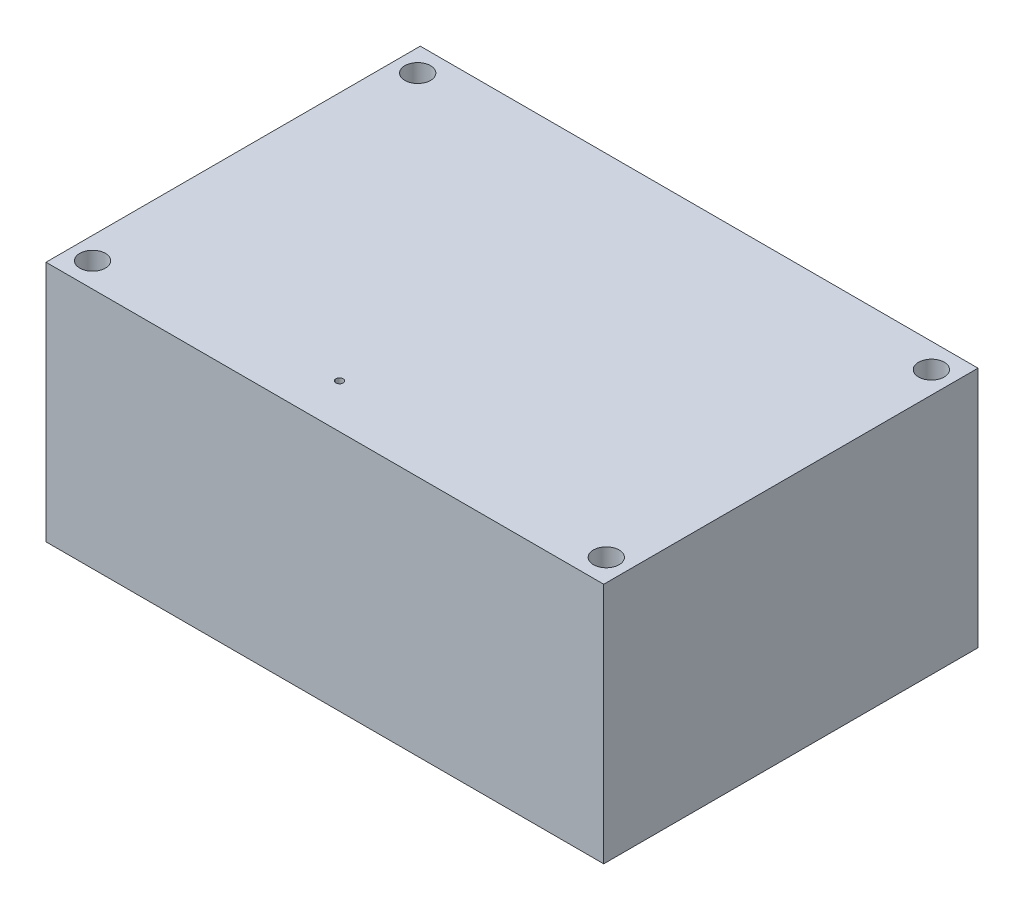
ISO-10303-21;
HEADER;
FILE_DESCRIPTION(('STEP AP214'),'2;1');
FILE_NAME('part.step','',(''),(''),'','','');
FILE_SCHEMA(('AUTOMOTIVE_DESIGN { 1 0 10303 214 1 1 1 1 }'));
ENDSEC;
DATA;
#1=APPLICATION_CONTEXT('core data for automotive mechanical design processes');
#2=APPLICATION_PROTOCOL_DEFINITION('international standard','automotive_design',2000,#1);
#3=PRODUCT_CONTEXT('',#1,'mechanical');
#4=PRODUCT('Part','Part','',(#3));
#5=PRODUCT_RELATED_PRODUCT_CATEGORY('part','',(#4));
#6=PRODUCT_DEFINITION_FORMATION('','',#4);
#7=PRODUCT_DEFINITION_CONTEXT('part definition',#1,'design');
#8=PRODUCT_DEFINITION('design','',#6,#7);
#9=PRODUCT_DEFINITION_SHAPE('','',#8);
#10=(LENGTH_UNIT() NAMED_UNIT(*) SI_UNIT(.MILLI.,.METRE.));
#11=(NAMED_UNIT(*) PLANE_ANGLE_UNIT() SI_UNIT($,.RADIAN.));
#12=(NAMED_UNIT(*) SI_UNIT($,.STERADIAN.) SOLID_ANGLE_UNIT());
#13=UNCERTAINTY_MEASURE_WITH_UNIT(LENGTH_MEASURE(1.E-05),#10,'distance_accuracy_value','');
#14=(GEOMETRIC_REPRESENTATION_CONTEXT(3) GLOBAL_UNCERTAINTY_ASSIGNED_CONTEXT((#13)) GLOBAL_UNIT_ASSIGNED_CONTEXT((#10,
#11,#12)) REPRESENTATION_CONTEXT('',''));
#15=CARTESIAN_POINT('',(0.,0.,0.));
#16=DIRECTION('',(0.,0.,1.));
#17=DIRECTION('',(1.,0.,0.));
#18=AXIS2_PLACEMENT_3D('',#15,#16,#17);
#19=CARTESIAN_POINT('',(38.,33.,25.5));
#20=DIRECTION('',(-1.,0.,0.));
#21=DIRECTION('',(0.,0.,1.));
#22=AXIS2_PLACEMENT_3D('',#19,#20,#21);
#23=PLANE('',#22);
#24=DIRECTION('',(0.,0.,-1.));
#25=VECTOR('',#24,1.);
#26=CARTESIAN_POINT('',(38.,0.,25.5));
#27=LINE('',#26,#25);
#28=CARTESIAN_POINT('',(38.,0.,25.5));
#29=VERTEX_POINT('',#28);
#30=CARTESIAN_POINT('',(38.,0.,-25.5));
#31=VERTEX_POINT('',#30);
#32=EDGE_CURVE('E107',#29,#31,#27,.T.);
#33=ORIENTED_EDGE('',*,*,#32,.T.);
#34=DIRECTION('',(0.,-1.,0.));
#35=VECTOR('',#34,1.);
#36=CARTESIAN_POINT('',(38.,33.,-25.5));
#37=LINE('',#36,#35);
#38=CARTESIAN_POINT('',(38.,33.,-25.5));
#39=VERTEX_POINT('',#38);
#40=EDGE_CURVE('E11',#39,#31,#37,.T.);
#41=ORIENTED_EDGE('',*,*,#40,.F.);
#42=DIRECTION('',(0.,0.,-1.));
#43=VECTOR('',#42,1.);
#44=CARTESIAN_POINT('',(38.,33.,25.5));
#45=LINE('',#44,#43);
#46=CARTESIAN_POINT('',(38.,33.,25.5));
#47=VERTEX_POINT('',#46);
#48=EDGE_CURVE('E91',#47,#39,#45,.T.);
#49=ORIENTED_EDGE('',*,*,#48,.F.);
#50=DIRECTION('',(0.,-1.,0.));
#51=VECTOR('',#50,1.);
#52=CARTESIAN_POINT('',(38.,33.,25.5));
#53=LINE('',#52,#51);
#54=EDGE_CURVE('E103',#47,#29,#53,.T.);
#55=ORIENTED_EDGE('',*,*,#54,.T.);
#56=EDGE_LOOP('',(#33,#41,#49,#55));
#57=FACE_BOUND('',#56,.T.);
#58=ADVANCED_FACE('F39',(#57),#23,.F.);
#59=CARTESIAN_POINT('',(-38.,33.,-25.5));
#60=DIRECTION('',(0.,0.,1.));
#61=DIRECTION('',(1.,0.,0.));
#62=AXIS2_PLACEMENT_3D('',#59,#60,#61);
#63=PLANE('',#62);
#64=DIRECTION('',(-1.,0.,0.));
#65=VECTOR('',#64,1.);
#66=CARTESIAN_POINT('',(-38.,0.,-25.5));
#67=LINE('',#66,#65);
#68=CARTESIAN_POINT('',(-38.,0.,-25.5));
#69=VERTEX_POINT('',#68);
#70=EDGE_CURVE('E96',#31,#69,#67,.T.);
#71=ORIENTED_EDGE('',*,*,#70,.T.);
#72=DIRECTION('',(0.,-1.,0.));
#73=VECTOR('',#72,1.);
#74=CARTESIAN_POINT('',(-38.,33.,-25.5));
#75=LINE('',#74,#73);
#76=CARTESIAN_POINT('',(-38.,33.,-25.5));
#77=VERTEX_POINT('',#76);
#78=EDGE_CURVE('E48',#77,#69,#75,.T.);
#79=ORIENTED_EDGE('',*,*,#78,.F.);
#80=DIRECTION('',(-1.,0.,0.));
#81=VECTOR('',#80,1.);
#82=CARTESIAN_POINT('',(-38.,33.,-25.5));
#83=LINE('',#82,#81);
#84=EDGE_CURVE('E86',#39,#77,#83,.T.);
#85=ORIENTED_EDGE('',*,*,#84,.F.);
#86=ORIENTED_EDGE('',*,*,#40,.T.);
#87=EDGE_LOOP('',(#71,#79,#85,#86));
#88=FACE_BOUND('',#87,.T.);
#89=ADVANCED_FACE('F95',(#88),#63,.F.);
#90=CARTESIAN_POINT('',(-38.,33.,25.5));
#91=DIRECTION('',(1.,0.,0.));
#92=DIRECTION('',(0.,0.,-1.));
#93=AXIS2_PLACEMENT_3D('',#90,#91,#92);
#94=PLANE('',#93);
#95=DIRECTION('',(0.,0.,1.));
#96=VECTOR('',#95,1.);
#97=CARTESIAN_POINT('',(-38.,0.,25.5));
#98=LINE('',#97,#96);
#99=CARTESIAN_POINT('',(-38.,0.,25.5));
#100=VERTEX_POINT('',#99);
#101=EDGE_CURVE('E73',#69,#100,#98,.T.);
#102=ORIENTED_EDGE('',*,*,#101,.T.);
#103=DIRECTION('',(0.,-1.,0.));
#104=VECTOR('',#103,1.);
#105=CARTESIAN_POINT('',(-38.,33.,25.5));
#106=LINE('',#105,#104);
#107=CARTESIAN_POINT('',(-38.,33.,25.5));
#108=VERTEX_POINT('',#107);
#109=EDGE_CURVE('E98',#108,#100,#106,.T.);
#110=ORIENTED_EDGE('',*,*,#109,.F.);
#111=DIRECTION('',(0.,0.,1.));
#112=VECTOR('',#111,1.);
#113=CARTESIAN_POINT('',(-38.,33.,25.5));
#114=LINE('',#113,#112);
#115=EDGE_CURVE('E89',#77,#108,#114,.T.);
#116=ORIENTED_EDGE('',*,*,#115,.F.);
#117=ORIENTED_EDGE('',*,*,#78,.T.);
#118=EDGE_LOOP('',(#102,#110,#116,#117));
#119=FACE_BOUND('',#118,.T.);
#120=ADVANCED_FACE('F99',(#119),#94,.F.);
#121=CARTESIAN_POINT('',(-38.,33.,25.5));
#122=DIRECTION('',(0.,0.,-1.));
#123=DIRECTION('',(-1.,0.,0.));
#124=AXIS2_PLACEMENT_3D('',#121,#122,#123);
#125=PLANE('',#124);
#126=DIRECTION('',(1.,0.,0.));
#127=VECTOR('',#126,1.);
#128=CARTESIAN_POINT('',(-38.,0.,25.5));
#129=LINE('',#128,#127);
#130=EDGE_CURVE('E79',#100,#29,#129,.T.);
#131=ORIENTED_EDGE('',*,*,#130,.T.);
#132=ORIENTED_EDGE('',*,*,#54,.F.);
#133=DIRECTION('',(1.,0.,0.));
#134=VECTOR('',#133,1.);
#135=CARTESIAN_POINT('',(-38.,33.,25.5));
#136=LINE('',#135,#134);
#137=EDGE_CURVE('E56',#108,#47,#136,.T.);
#138=ORIENTED_EDGE('',*,*,#137,.F.);
#139=ORIENTED_EDGE('',*,*,#109,.T.);
#140=EDGE_LOOP('',(#131,#132,#138,#139));
#141=FACE_BOUND('',#140,.T.);
#142=ADVANCED_FACE('F121',(#141),#125,.F.);
#143=CARTESIAN_POINT('',(0.,33.,0.));
#144=DIRECTION('',(0.,-1.,0.));
#145=DIRECTION('',(0.,0.,-1.));
#146=AXIS2_PLACEMENT_3D('',#143,#144,#145);
#147=PLANE('',#146);
#148=CARTESIAN_POINT('',(-4.,33.,19.5));
#149=DIRECTION('',(0.,1.,0.));
#150=DIRECTION('',(0.,0.,1.));
#151=AXIS2_PLACEMENT_3D('',#148,#149,#150);
#152=CIRCLE('',#151,0.5);
#153=CARTESIAN_POINT('',(-4.,33.,20.));
#154=VERTEX_POINT('',#153);
#155=EDGE_CURVE('E160',#154,#154,#152,.T.);
#156=ORIENTED_EDGE('',*,*,#155,.F.);
#157=EDGE_LOOP('',(#156));
#158=FACE_BOUND('',#157,.T.);
#159=CARTESIAN_POINT('',(-35.,33.,22.15));
#160=DIRECTION('',(0.,1.,0.));
#161=DIRECTION('',(0.,0.,1.));
#162=AXIS2_PLACEMENT_3D('',#159,#160,#161);
#163=CIRCLE('',#162,1.75);
#164=CARTESIAN_POINT('',(-35.,33.,23.9));
#165=VERTEX_POINT('',#164);
#166=EDGE_CURVE('E140',#165,#165,#163,.T.);
#167=ORIENTED_EDGE('',*,*,#166,.F.);
#168=EDGE_LOOP('',(#167));
#169=FACE_BOUND('',#168,.T.);
#170=CARTESIAN_POINT('',(35.,33.,22.15));
#171=DIRECTION('',(0.,1.,0.));
#172=DIRECTION('',(0.,0.,1.));
#173=AXIS2_PLACEMENT_3D('',#170,#171,#172);
#174=CIRCLE('',#173,1.75);
#175=CARTESIAN_POINT('',(35.,33.,23.9));
#176=VERTEX_POINT('',#175);
#177=EDGE_CURVE('E149',#176,#176,#174,.T.);
#178=ORIENTED_EDGE('',*,*,#177,.F.);
#179=EDGE_LOOP('',(#178));
#180=FACE_BOUND('',#179,.T.);
#181=CARTESIAN_POINT('',(35.,33.,-22.15));
#182=DIRECTION('',(0.,1.,0.));
#183=DIRECTION('',(0.,0.,1.));
#184=AXIS2_PLACEMENT_3D('',#181,#182,#183);
#185=CIRCLE('',#184,1.75);
#186=CARTESIAN_POINT('',(35.,33.,-20.4));
#187=VERTEX_POINT('',#186);
#188=EDGE_CURVE('E132',#187,#187,#185,.T.);
#189=ORIENTED_EDGE('',*,*,#188,.F.);
#190=EDGE_LOOP('',(#189));
#191=FACE_BOUND('',#190,.T.);
#192=CARTESIAN_POINT('',(-35.,33.,-22.15));
#193=DIRECTION('',(0.,1.,0.));
#194=DIRECTION('',(0.,0.,1.));
#195=AXIS2_PLACEMENT_3D('',#192,#193,#194);
#196=CIRCLE('',#195,1.75);
#197=CARTESIAN_POINT('',(-35.,33.,-20.4));
#198=VERTEX_POINT('',#197);
#199=EDGE_CURVE('E111',#198,#198,#196,.T.);
#200=ORIENTED_EDGE('',*,*,#199,.F.);
#201=EDGE_LOOP('',(#200));
#202=FACE_BOUND('',#201,.T.);
#203=ORIENTED_EDGE('',*,*,#48,.T.);
#204=ORIENTED_EDGE('',*,*,#84,.T.);
#205=ORIENTED_EDGE('',*,*,#115,.T.);
#206=ORIENTED_EDGE('',*,*,#137,.T.);
#207=EDGE_LOOP('',(#203,#204,#205,#206));
#208=FACE_BOUND('',#207,.T.);
#209=ADVANCED_FACE('F87',(#158,#169,#180,#191,#202,#208),#147,.F.);
#210=CARTESIAN_POINT('',(0.,0.,0.));
#211=DIRECTION('',(0.,-1.,0.));
#212=DIRECTION('',(0.,0.,-1.));
#213=AXIS2_PLACEMENT_3D('',#210,#211,#212);
#214=PLANE('',#213);
#215=CARTESIAN_POINT('',(-35.,0.,22.15));
#216=DIRECTION('',(0.,1.,0.));
#217=DIRECTION('',(0.,0.,1.));
#218=AXIS2_PLACEMENT_3D('',#215,#216,#217);
#219=CIRCLE('',#218,1.75);
#220=CARTESIAN_POINT('',(-35.,0.,23.9));
#221=VERTEX_POINT('',#220);
#222=EDGE_CURVE('E136',#221,#221,#219,.T.);
#223=ORIENTED_EDGE('',*,*,#222,.T.);
#224=EDGE_LOOP('',(#223));
#225=FACE_BOUND('',#224,.T.);
#226=CARTESIAN_POINT('',(35.,0.,22.15));
#227=DIRECTION('',(0.,1.,0.));
#228=DIRECTION('',(0.,0.,1.));
#229=AXIS2_PLACEMENT_3D('',#226,#227,#228);
#230=CIRCLE('',#229,1.75);
#231=CARTESIAN_POINT('',(35.,0.,23.9));
#232=VERTEX_POINT('',#231);
#233=EDGE_CURVE('E145',#232,#232,#230,.T.);
#234=ORIENTED_EDGE('',*,*,#233,.T.);
#235=EDGE_LOOP('',(#234));
#236=FACE_BOUND('',#235,.T.);
#237=CARTESIAN_POINT('',(35.,0.,-22.15));
#238=DIRECTION('',(0.,1.,0.));
#239=DIRECTION('',(0.,0.,1.));
#240=AXIS2_PLACEMENT_3D('',#237,#238,#239);
#241=CIRCLE('',#240,1.75);
#242=CARTESIAN_POINT('',(35.,0.,-20.4));
#243=VERTEX_POINT('',#242);
#244=EDGE_CURVE('E153',#243,#243,#241,.T.);
#245=ORIENTED_EDGE('',*,*,#244,.T.);
#246=EDGE_LOOP('',(#245));
#247=FACE_BOUND('',#246,.T.);
#248=CARTESIAN_POINT('',(-35.,0.,-22.15));
#249=DIRECTION('',(0.,1.,0.));
#250=DIRECTION('',(0.,0.,1.));
#251=AXIS2_PLACEMENT_3D('',#248,#249,#250);
#252=CIRCLE('',#251,1.75);
#253=CARTESIAN_POINT('',(-35.,0.,-20.4));
#254=VERTEX_POINT('',#253);
#255=EDGE_CURVE('E128',#254,#254,#252,.T.);
#256=ORIENTED_EDGE('',*,*,#255,.T.);
#257=EDGE_LOOP('',(#256));
#258=FACE_BOUND('',#257,.T.);
#259=ORIENTED_EDGE('',*,*,#32,.F.);
#260=ORIENTED_EDGE('',*,*,#130,.F.);
#261=ORIENTED_EDGE('',*,*,#101,.F.);
#262=ORIENTED_EDGE('',*,*,#70,.F.);
#263=EDGE_LOOP('',(#259,#260,#261,#262));
#264=FACE_BOUND('',#263,.T.);
#265=ADVANCED_FACE('F124',(#225,#236,#247,#258,#264),#214,.T.);
#266=CARTESIAN_POINT('',(-35.,33.,-22.15));
#267=DIRECTION('',(0.,-1.,0.));
#268=DIRECTION('',(0.,0.,-1.));
#269=AXIS2_PLACEMENT_3D('',#266,#267,#268);
#270=CYLINDRICAL_SURFACE('',#269,1.75);
#271=ORIENTED_EDGE('',*,*,#199,.T.);
#272=EDGE_LOOP('',(#271));
#273=FACE_BOUND('',#272,.T.);
#274=ORIENTED_EDGE('',*,*,#255,.F.);
#275=EDGE_LOOP('',(#274));
#276=FACE_BOUND('',#275,.T.);
#277=ADVANCED_FACE('F188',(#273,#276),#270,.F.);
#278=CARTESIAN_POINT('',(35.,33.,-22.15));
#279=DIRECTION('',(0.,-1.,0.));
#280=DIRECTION('',(0.,0.,-1.));
#281=AXIS2_PLACEMENT_3D('',#278,#279,#280);
#282=CYLINDRICAL_SURFACE('',#281,1.75);
#283=ORIENTED_EDGE('',*,*,#188,.T.);
#284=EDGE_LOOP('',(#283));
#285=FACE_BOUND('',#284,.T.);
#286=ORIENTED_EDGE('',*,*,#244,.F.);
#287=EDGE_LOOP('',(#286));
#288=FACE_BOUND('',#287,.T.);
#289=ADVANCED_FACE('F191',(#285,#288),#282,.F.);
#290=CARTESIAN_POINT('',(35.,33.,22.15));
#291=DIRECTION('',(0.,-1.,0.));
#292=DIRECTION('',(0.,0.,-1.));
#293=AXIS2_PLACEMENT_3D('',#290,#291,#292);
#294=CYLINDRICAL_SURFACE('',#293,1.75);
#295=ORIENTED_EDGE('',*,*,#177,.T.);
#296=EDGE_LOOP('',(#295));
#297=FACE_BOUND('',#296,.T.);
#298=ORIENTED_EDGE('',*,*,#233,.F.);
#299=EDGE_LOOP('',(#298));
#300=FACE_BOUND('',#299,.T.);
#301=ADVANCED_FACE('F246',(#297,#300),#294,.F.);
#302=CARTESIAN_POINT('',(-35.,33.,22.15));
#303=DIRECTION('',(0.,-1.,0.));
#304=DIRECTION('',(0.,0.,-1.));
#305=AXIS2_PLACEMENT_3D('',#302,#303,#304);
#306=CYLINDRICAL_SURFACE('',#305,1.75);
#307=ORIENTED_EDGE('',*,*,#166,.T.);
#308=EDGE_LOOP('',(#307));
#309=FACE_BOUND('',#308,.T.);
#310=ORIENTED_EDGE('',*,*,#222,.F.);
#311=EDGE_LOOP('',(#310));
#312=FACE_BOUND('',#311,.T.);
#313=ADVANCED_FACE('F173',(#309,#312),#306,.F.);
#314=CARTESIAN_POINT('',(-4.,28.,19.5));
#315=DIRECTION('',(0.,1.,0.));
#316=DIRECTION('',(0.,0.,1.));
#317=AXIS2_PLACEMENT_3D('',#314,#315,#316);
#318=CYLINDRICAL_SURFACE('',#317,0.5);
#319=CARTESIAN_POINT('',(-4.,28.,19.5));
#320=DIRECTION('',(0.,1.,0.));
#321=DIRECTION('',(0.,0.,1.));
#322=AXIS2_PLACEMENT_3D('',#319,#320,#321);
#323=CIRCLE('',#322,0.5);
#324=CARTESIAN_POINT('',(-4.,28.,20.));
#325=VERTEX_POINT('',#324);
#326=EDGE_CURVE('E141',#325,#325,#323,.T.);
#327=ORIENTED_EDGE('',*,*,#326,.F.);
#328=EDGE_LOOP('',(#327));
#329=FACE_BOUND('',#328,.T.);
#330=ORIENTED_EDGE('',*,*,#155,.T.);
#331=EDGE_LOOP('',(#330));
#332=FACE_BOUND('',#331,.T.);
#333=ADVANCED_FACE('F170',(#329,#332),#318,.F.);
#334=CARTESIAN_POINT('',(-4.,28.,19.5));
#335=DIRECTION('',(0.,1.,0.));
#336=DIRECTION('',(0.,0.,1.));
#337=AXIS2_PLACEMENT_3D('',#334,#335,#336);
#338=PLANE('',#337);
#339=ORIENTED_EDGE('',*,*,#326,.T.);
#340=EDGE_LOOP('',(#339));
#341=FACE_BOUND('',#340,.T.);
#342=ADVANCED_FACE('F168',(#341),#338,.T.);
#343=CLOSED_SHELL('',(#58,#89,#120,#142,#209,#265,#277,#289,#301,#313,#333,#342));
#344=MANIFOLD_SOLID_BREP('B2',#343);
#345=ADVANCED_BREP_SHAPE_REPRESENTATION('',(#18,#344),#14);
#346=SHAPE_DEFINITION_REPRESENTATION(#9,#345);
ENDSEC;
END-ISO-10303-21;
